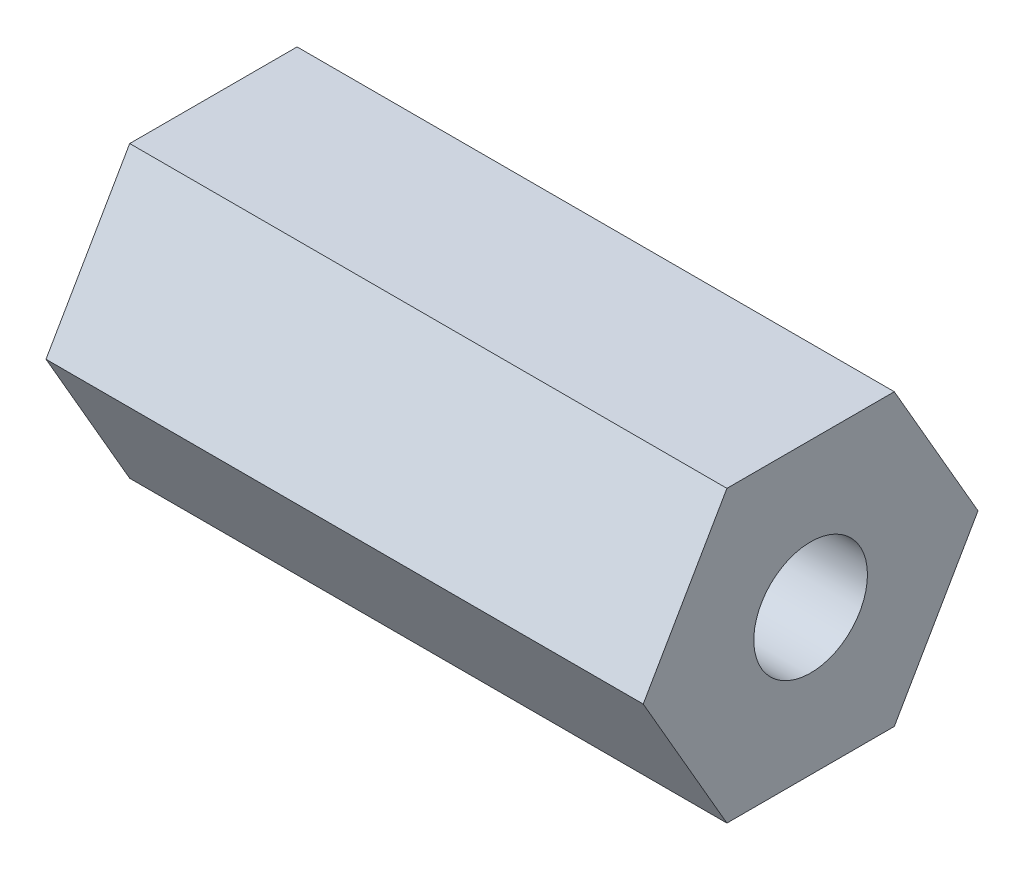
ISO-10303-21;
HEADER;
FILE_DESCRIPTION(('STEP AP214'),'2;1');
FILE_NAME('part.step','',(''),(''),'','','');
FILE_SCHEMA(('AUTOMOTIVE_DESIGN { 1 0 10303 214 1 1 1 1 }'));
ENDSEC;
DATA;
#1=APPLICATION_CONTEXT('core data for automotive mechanical design processes');
#2=APPLICATION_PROTOCOL_DEFINITION('international standard','automotive_design',2000,#1);
#3=PRODUCT_CONTEXT('',#1,'mechanical');
#4=PRODUCT('Part','Part','',(#3));
#5=PRODUCT_RELATED_PRODUCT_CATEGORY('part','',(#4));
#6=PRODUCT_DEFINITION_FORMATION('','',#4);
#7=PRODUCT_DEFINITION_CONTEXT('part definition',#1,'design');
#8=PRODUCT_DEFINITION('design','',#6,#7);
#9=PRODUCT_DEFINITION_SHAPE('','',#8);
#10=(LENGTH_UNIT() NAMED_UNIT(*) SI_UNIT(.MILLI.,.METRE.));
#11=(NAMED_UNIT(*) PLANE_ANGLE_UNIT() SI_UNIT($,.RADIAN.));
#12=(NAMED_UNIT(*) SI_UNIT($,.STERADIAN.) SOLID_ANGLE_UNIT());
#13=UNCERTAINTY_MEASURE_WITH_UNIT(LENGTH_MEASURE(1.E-05),#10,'distance_accuracy_value','');
#14=(GEOMETRIC_REPRESENTATION_CONTEXT(3) GLOBAL_UNCERTAINTY_ASSIGNED_CONTEXT((#13)) GLOBAL_UNIT_ASSIGNED_CONTEXT((#10,
#11,#12)) REPRESENTATION_CONTEXT('',''));
#15=CARTESIAN_POINT('',(0.,0.,0.));
#16=DIRECTION('',(0.,0.,1.));
#17=DIRECTION('',(1.,0.,0.));
#18=AXIS2_PLACEMENT_3D('',#15,#16,#17);
#19=CARTESIAN_POINT('',(26.162,0.,0.));
#20=DIRECTION('',(1.,0.,0.));
#21=DIRECTION('',(0.,0.,-1.));
#22=AXIS2_PLACEMENT_3D('',#19,#20,#21);
#23=PLANE('',#22);
#24=DIRECTION('',(0.,0.866025403784441,-0.499999999999995));
#25=VECTOR('',#24,1.);
#26=CARTESIAN_POINT('',(26.162,-6.34999999999993,-3.66617420935418));
#27=LINE('',#26,#25);
#28=CARTESIAN_POINT('',(26.162,-6.34999999999993,-3.66617420935418));
#29=VERTEX_POINT('',#28);
#30=CARTESIAN_POINT('',(26.162,0.,-7.33234841870822));
#31=VERTEX_POINT('',#30);
#32=EDGE_CURVE('E129',#29,#31,#27,.T.);
#33=ORIENTED_EDGE('',*,*,#32,.T.);
#34=DIRECTION('',(0.,0.866025403784438,0.500000000000001));
#35=VECTOR('',#34,1.);
#36=CARTESIAN_POINT('',(26.162,0.,-7.33234841870822));
#37=LINE('',#36,#35);
#38=CARTESIAN_POINT('',(26.162,6.34999999999999,-3.6661742093541));
#39=VERTEX_POINT('',#38);
#40=EDGE_CURVE('E87',#31,#39,#37,.T.);
#41=ORIENTED_EDGE('',*,*,#40,.T.);
#42=DIRECTION('',(0.,0.,1.));
#43=VECTOR('',#42,1.);
#44=CARTESIAN_POINT('',(26.162,6.34999999999999,-3.6661742093541));
#45=LINE('',#44,#43);
#46=CARTESIAN_POINT('',(26.162,6.34999999999996,3.66617420935414));
#47=VERTEX_POINT('',#46);
#48=EDGE_CURVE('E100',#39,#47,#45,.T.);
#49=ORIENTED_EDGE('',*,*,#48,.T.);
#50=DIRECTION('',(0.,-0.866025403784441,0.499999999999995));
#51=VECTOR('',#50,1.);
#52=CARTESIAN_POINT('',(26.162,6.34999999999996,3.66617420935414));
#53=LINE('',#52,#51);
#54=CARTESIAN_POINT('',(26.162,0.,7.33234841870822));
#55=VERTEX_POINT('',#54);
#56=EDGE_CURVE('E94',#47,#55,#53,.T.);
#57=ORIENTED_EDGE('',*,*,#56,.T.);
#58=DIRECTION('',(0.,-0.866025403784435,-0.500000000000007));
#59=VECTOR('',#58,1.);
#60=CARTESIAN_POINT('',(26.162,0.,7.33234841870822));
#61=LINE('',#60,#59);
#62=CARTESIAN_POINT('',(26.162,-6.35000000000001,3.66617420935405));
#63=VERTEX_POINT('',#62);
#64=EDGE_CURVE('E98',#55,#63,#61,.T.);
#65=ORIENTED_EDGE('',*,*,#64,.T.);
#66=DIRECTION('',(0.,0.,-1.));
#67=VECTOR('',#66,1.);
#68=CARTESIAN_POINT('',(26.162,-6.35000000000001,3.66617420935405));
#69=LINE('',#68,#67);
#70=EDGE_CURVE('E50',#63,#29,#69,.T.);
#71=ORIENTED_EDGE('',*,*,#70,.T.);
#72=EDGE_LOOP('',(#33,#41,#49,#57,#65,#71));
#73=FACE_BOUND('',#72,.T.);
#74=CARTESIAN_POINT('',(26.162,0.,0.));
#75=DIRECTION('',(1.,0.,0.));
#76=DIRECTION('',(0.,0.,-1.));
#77=AXIS2_PLACEMENT_3D('',#74,#75,#76);
#78=CIRCLE('',#77,2.4892);
#79=CARTESIAN_POINT('',(26.162,0.,-2.4892));
#80=VERTEX_POINT('',#79);
#81=EDGE_CURVE('E122',#80,#80,#78,.T.);
#82=ORIENTED_EDGE('',*,*,#81,.F.);
#83=EDGE_LOOP('',(#82));
#84=FACE_BOUND('',#83,.T.);
#85=ADVANCED_FACE('F33',(#73,#84),#23,.T.);
#86=CARTESIAN_POINT('',(0.,0.,0.));
#87=DIRECTION('',(1.,0.,0.));
#88=DIRECTION('',(0.,0.,-1.));
#89=AXIS2_PLACEMENT_3D('',#86,#87,#88);
#90=PLANE('',#89);
#91=DIRECTION('',(0.,0.866025403784441,-0.499999999999995));
#92=VECTOR('',#91,1.);
#93=CARTESIAN_POINT('',(0.,-6.34999999999993,-3.66617420935418));
#94=LINE('',#93,#92);
#95=CARTESIAN_POINT('',(0.,-6.34999999999993,-3.66617420935418));
#96=VERTEX_POINT('',#95);
#97=CARTESIAN_POINT('',(0.,0.,-7.33234841870822));
#98=VERTEX_POINT('',#97);
#99=EDGE_CURVE('E118',#96,#98,#94,.T.);
#100=ORIENTED_EDGE('',*,*,#99,.F.);
#101=DIRECTION('',(0.,0.,-1.));
#102=VECTOR('',#101,1.);
#103=CARTESIAN_POINT('',(0.,-6.35000000000001,3.66617420935405));
#104=LINE('',#103,#102);
#105=CARTESIAN_POINT('',(0.,-6.35000000000001,3.66617420935405));
#106=VERTEX_POINT('',#105);
#107=EDGE_CURVE('E79',#106,#96,#104,.T.);
#108=ORIENTED_EDGE('',*,*,#107,.F.);
#109=DIRECTION('',(0.,-0.866025403784435,-0.500000000000007));
#110=VECTOR('',#109,1.);
#111=CARTESIAN_POINT('',(0.,0.,7.33234841870822));
#112=LINE('',#111,#110);
#113=CARTESIAN_POINT('',(0.,0.,7.33234841870822));
#114=VERTEX_POINT('',#113);
#115=EDGE_CURVE('E73',#114,#106,#112,.T.);
#116=ORIENTED_EDGE('',*,*,#115,.F.);
#117=DIRECTION('',(0.,-0.866025403784441,0.499999999999995));
#118=VECTOR('',#117,1.);
#119=CARTESIAN_POINT('',(0.,6.34999999999996,3.66617420935414));
#120=LINE('',#119,#118);
#121=CARTESIAN_POINT('',(0.,6.34999999999996,3.66617420935414));
#122=VERTEX_POINT('',#121);
#123=EDGE_CURVE('E108',#122,#114,#120,.T.);
#124=ORIENTED_EDGE('',*,*,#123,.F.);
#125=DIRECTION('',(0.,0.,1.));
#126=VECTOR('',#125,1.);
#127=CARTESIAN_POINT('',(0.,6.34999999999999,-3.6661742093541));
#128=LINE('',#127,#126);
#129=CARTESIAN_POINT('',(0.,6.34999999999999,-3.6661742093541));
#130=VERTEX_POINT('',#129);
#131=EDGE_CURVE('E124',#130,#122,#128,.T.);
#132=ORIENTED_EDGE('',*,*,#131,.F.);
#133=DIRECTION('',(0.,0.866025403784438,0.500000000000001));
#134=VECTOR('',#133,1.);
#135=CARTESIAN_POINT('',(0.,0.,-7.33234841870822));
#136=LINE('',#135,#134);
#137=EDGE_CURVE('E121',#98,#130,#136,.T.);
#138=ORIENTED_EDGE('',*,*,#137,.F.);
#139=EDGE_LOOP('',(#100,#108,#116,#124,#132,#138));
#140=FACE_BOUND('',#139,.T.);
#141=CARTESIAN_POINT('',(0.,0.,0.));
#142=DIRECTION('',(1.,0.,0.));
#143=DIRECTION('',(0.,0.,-1.));
#144=AXIS2_PLACEMENT_3D('',#141,#142,#143);
#145=CIRCLE('',#144,2.4892);
#146=CARTESIAN_POINT('',(0.,0.,-2.4892));
#147=VERTEX_POINT('',#146);
#148=EDGE_CURVE('E222',#147,#147,#145,.T.);
#149=ORIENTED_EDGE('',*,*,#148,.T.);
#150=EDGE_LOOP('',(#149));
#151=FACE_BOUND('',#150,.T.);
#152=ADVANCED_FACE('F138',(#140,#151),#90,.F.);
#153=CARTESIAN_POINT('',(26.162,-6.34999999999993,-3.66617420935418));
#154=DIRECTION('',(0.,0.499999999999995,0.866025403784442));
#155=DIRECTION('',(0.,-0.866025403784442,0.499999999999995));
#156=AXIS2_PLACEMENT_3D('',#153,#154,#155);
#157=PLANE('',#156);
#158=ORIENTED_EDGE('',*,*,#99,.T.);
#159=DIRECTION('',(-1.,0.,0.));
#160=VECTOR('',#159,1.);
#161=CARTESIAN_POINT('',(26.162,0.,-7.33234841870822));
#162=LINE('',#161,#160);
#163=EDGE_CURVE('E11',#31,#98,#162,.T.);
#164=ORIENTED_EDGE('',*,*,#163,.F.);
#165=ORIENTED_EDGE('',*,*,#32,.F.);
#166=DIRECTION('',(-1.,0.,0.));
#167=VECTOR('',#166,1.);
#168=CARTESIAN_POINT('',(26.162,-6.34999999999993,-3.66617420935418));
#169=LINE('',#168,#167);
#170=EDGE_CURVE('E114',#29,#96,#169,.T.);
#171=ORIENTED_EDGE('',*,*,#170,.T.);
#172=EDGE_LOOP('',(#158,#164,#165,#171));
#173=FACE_BOUND('',#172,.T.);
#174=ADVANCED_FACE('F35',(#173),#157,.F.);
#175=CARTESIAN_POINT('',(26.162,0.,-7.33234841870822));
#176=DIRECTION('',(0.,-0.500000000000001,0.866025403784438));
#177=DIRECTION('',(0.,-0.866025403784438,-0.500000000000001));
#178=AXIS2_PLACEMENT_3D('',#175,#176,#177);
#179=PLANE('',#178);
#180=ORIENTED_EDGE('',*,*,#137,.T.);
#181=DIRECTION('',(-1.,0.,0.));
#182=VECTOR('',#181,1.);
#183=CARTESIAN_POINT('',(26.162,6.34999999999999,-3.6661742093541));
#184=LINE('',#183,#182);
#185=EDGE_CURVE('E42',#39,#130,#184,.T.);
#186=ORIENTED_EDGE('',*,*,#185,.F.);
#187=ORIENTED_EDGE('',*,*,#40,.F.);
#188=ORIENTED_EDGE('',*,*,#163,.T.);
#189=EDGE_LOOP('',(#180,#186,#187,#188));
#190=FACE_BOUND('',#189,.T.);
#191=ADVANCED_FACE('F163',(#190),#179,.F.);
#192=CARTESIAN_POINT('',(26.162,6.34999999999999,-3.6661742093541));
#193=DIRECTION('',(0.,-1.,0.));
#194=DIRECTION('',(0.,0.,-1.));
#195=AXIS2_PLACEMENT_3D('',#192,#193,#194);
#196=PLANE('',#195);
#197=ORIENTED_EDGE('',*,*,#131,.T.);
#198=DIRECTION('',(-1.,0.,0.));
#199=VECTOR('',#198,1.);
#200=CARTESIAN_POINT('',(26.162,6.34999999999996,3.66617420935414));
#201=LINE('',#200,#199);
#202=EDGE_CURVE('E109',#47,#122,#201,.T.);
#203=ORIENTED_EDGE('',*,*,#202,.F.);
#204=ORIENTED_EDGE('',*,*,#48,.F.);
#205=ORIENTED_EDGE('',*,*,#185,.T.);
#206=EDGE_LOOP('',(#197,#203,#204,#205));
#207=FACE_BOUND('',#206,.T.);
#208=ADVANCED_FACE('F135',(#207),#196,.F.);
#209=CARTESIAN_POINT('',(26.162,6.34999999999996,3.66617420935414));
#210=DIRECTION('',(0.,-0.499999999999995,-0.866025403784442));
#211=DIRECTION('',(0.,0.866025403784442,-0.499999999999995));
#212=AXIS2_PLACEMENT_3D('',#209,#210,#211);
#213=PLANE('',#212);
#214=ORIENTED_EDGE('',*,*,#123,.T.);
#215=DIRECTION('',(-1.,0.,0.));
#216=VECTOR('',#215,1.);
#217=CARTESIAN_POINT('',(26.162,0.,7.33234841870822));
#218=LINE('',#217,#216);
#219=EDGE_CURVE('E105',#55,#114,#218,.T.);
#220=ORIENTED_EDGE('',*,*,#219,.F.);
#221=ORIENTED_EDGE('',*,*,#56,.F.);
#222=ORIENTED_EDGE('',*,*,#202,.T.);
#223=EDGE_LOOP('',(#214,#220,#221,#222));
#224=FACE_BOUND('',#223,.T.);
#225=ADVANCED_FACE('F106',(#224),#213,.F.);
#226=CARTESIAN_POINT('',(26.162,0.,7.33234841870822));
#227=DIRECTION('',(0.,0.500000000000007,-0.866025403784434));
#228=DIRECTION('',(0.,0.866025403784435,0.500000000000007));
#229=AXIS2_PLACEMENT_3D('',#226,#227,#228);
#230=PLANE('',#229);
#231=ORIENTED_EDGE('',*,*,#115,.T.);
#232=DIRECTION('',(-1.,0.,0.));
#233=VECTOR('',#232,1.);
#234=CARTESIAN_POINT('',(26.162,-6.35000000000001,3.66617420935405));
#235=LINE('',#234,#233);
#236=EDGE_CURVE('E110',#63,#106,#235,.T.);
#237=ORIENTED_EDGE('',*,*,#236,.F.);
#238=ORIENTED_EDGE('',*,*,#64,.F.);
#239=ORIENTED_EDGE('',*,*,#219,.T.);
#240=EDGE_LOOP('',(#231,#237,#238,#239));
#241=FACE_BOUND('',#240,.T.);
#242=ADVANCED_FACE('F112',(#241),#230,.F.);
#243=CARTESIAN_POINT('',(26.162,-6.35000000000001,3.66617420935405));
#244=DIRECTION('',(0.,1.,0.));
#245=DIRECTION('',(0.,0.,1.));
#246=AXIS2_PLACEMENT_3D('',#243,#244,#245);
#247=PLANE('',#246);
#248=ORIENTED_EDGE('',*,*,#107,.T.);
#249=ORIENTED_EDGE('',*,*,#170,.F.);
#250=ORIENTED_EDGE('',*,*,#70,.F.);
#251=ORIENTED_EDGE('',*,*,#236,.T.);
#252=EDGE_LOOP('',(#248,#249,#250,#251));
#253=FACE_BOUND('',#252,.T.);
#254=ADVANCED_FACE('F143',(#253),#247,.F.);
#255=CARTESIAN_POINT('',(26.162,0.,0.));
#256=DIRECTION('',(-1.,0.,0.));
#257=DIRECTION('',(0.,0.,1.));
#258=AXIS2_PLACEMENT_3D('',#255,#256,#257);
#259=CYLINDRICAL_SURFACE('',#258,2.4892);
#260=ORIENTED_EDGE('',*,*,#81,.T.);
#261=EDGE_LOOP('',(#260));
#262=FACE_BOUND('',#261,.T.);
#263=ORIENTED_EDGE('',*,*,#148,.F.);
#264=EDGE_LOOP('',(#263));
#265=FACE_BOUND('',#264,.T.);
#266=ADVANCED_FACE('F145',(#262,#265),#259,.F.);
#267=CLOSED_SHELL('',(#85,#152,#174,#191,#208,#225,#242,#254,#266));
#268=MANIFOLD_SOLID_BREP('B2',#267);
#269=ADVANCED_BREP_SHAPE_REPRESENTATION('',(#18,#268),#14);
#270=SHAPE_DEFINITION_REPRESENTATION(#9,#269);
ENDSEC;
END-ISO-10303-21;
